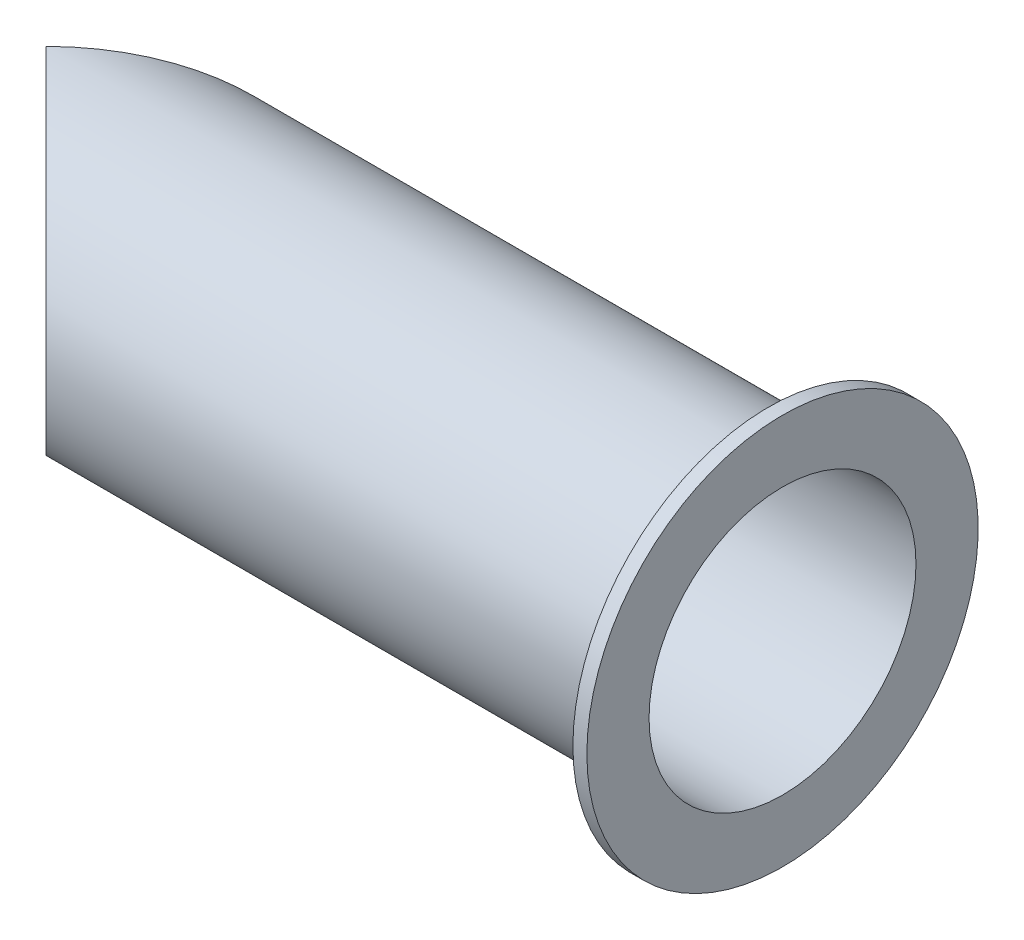
ISO-10303-21;
HEADER;
FILE_DESCRIPTION(('STEP AP214'),'2;1');
FILE_NAME('part.step','',(''),(''),'','','');
FILE_SCHEMA(('AUTOMOTIVE_DESIGN { 1 0 10303 214 1 1 1 1 }'));
ENDSEC;
DATA;
#1=APPLICATION_CONTEXT('core data for automotive mechanical design processes');
#2=APPLICATION_PROTOCOL_DEFINITION('international standard','automotive_design',2000,#1);
#3=PRODUCT_CONTEXT('',#1,'mechanical');
#4=PRODUCT('Part','Part','',(#3));
#5=PRODUCT_RELATED_PRODUCT_CATEGORY('part','',(#4));
#6=PRODUCT_DEFINITION_FORMATION('','',#4);
#7=PRODUCT_DEFINITION_CONTEXT('part definition',#1,'design');
#8=PRODUCT_DEFINITION('design','',#6,#7);
#9=PRODUCT_DEFINITION_SHAPE('','',#8);
#10=(LENGTH_UNIT() NAMED_UNIT(*) SI_UNIT(.MILLI.,.METRE.));
#11=(NAMED_UNIT(*) PLANE_ANGLE_UNIT() SI_UNIT($,.RADIAN.));
#12=(NAMED_UNIT(*) SI_UNIT($,.STERADIAN.) SOLID_ANGLE_UNIT());
#13=UNCERTAINTY_MEASURE_WITH_UNIT(LENGTH_MEASURE(1.E-05),#10,'distance_accuracy_value','');
#14=(GEOMETRIC_REPRESENTATION_CONTEXT(3) GLOBAL_UNCERTAINTY_ASSIGNED_CONTEXT((#13)) GLOBAL_UNIT_ASSIGNED_CONTEXT((#10,
#11,#12)) REPRESENTATION_CONTEXT('',''));
#15=CARTESIAN_POINT('',(0.,0.,0.));
#16=DIRECTION('',(0.,0.,1.));
#17=DIRECTION('',(1.,0.,0.));
#18=AXIS2_PLACEMENT_3D('',#15,#16,#17);
#19=CARTESIAN_POINT('',(0.,0.,0.));
#20=DIRECTION('',(-1.,0.,0.));
#21=DIRECTION('',(0.,0.,1.));
#22=AXIS2_PLACEMENT_3D('',#19,#20,#21);
#23=CYLINDRICAL_SURFACE('',#22,10.5);
#24=CARTESIAN_POINT('',(41.2,0.,0.));
#25=DIRECTION('',(-1.,0.,0.));
#26=DIRECTION('',(0.,0.,1.));
#27=AXIS2_PLACEMENT_3D('',#24,#25,#26);
#28=CIRCLE('',#27,10.5);
#29=CARTESIAN_POINT('',(41.2,0.,10.5));
#30=VERTEX_POINT('',#29);
#31=EDGE_CURVE('E59',#30,#30,#28,.T.);
#32=ORIENTED_EDGE('',*,*,#31,.T.);
#33=EDGE_LOOP('',(#32));
#34=FACE_BOUND('',#33,.T.);
#35=CARTESIAN_POINT('',(-10.5,0.,0.));
#36=DIRECTION('',(-0.707106781186547,0.,0.707106781186547));
#37=DIRECTION('',(-0.707106781186547,0.,-0.707106781186547));
#38=AXIS2_PLACEMENT_3D('',#35,#36,#37);
#39=ELLIPSE('',#38,14.8492424049175,10.5);
#40=CARTESIAN_POINT('',(-10.5,-10.5,0.));
#41=VERTEX_POINT('',#40);
#42=CARTESIAN_POINT('',(-10.5,10.5,0.));
#43=VERTEX_POINT('',#42);
#44=EDGE_CURVE('E52',#41,#43,#39,.T.);
#45=ORIENTED_EDGE('',*,*,#44,.F.);
#46=CARTESIAN_POINT('',(-10.5,0.,0.));
#47=DIRECTION('',(-0.707106781186547,0.,-0.707106781186547));
#48=DIRECTION('',(-0.707106781186547,0.,0.707106781186547));
#49=AXIS2_PLACEMENT_3D('',#46,#47,#48);
#50=ELLIPSE('',#49,14.8492424049175,10.5);
#51=EDGE_CURVE('E54',#43,#41,#50,.T.);
#52=ORIENTED_EDGE('',*,*,#51,.F.);
#53=EDGE_LOOP('',(#45,#52));
#54=FACE_BOUND('',#53,.T.);
#55=ADVANCED_FACE('F35',(#34,#54),#23,.T.);
#56=CARTESIAN_POINT('',(0.,0.,0.));
#57=DIRECTION('',(-1.,0.,0.));
#58=DIRECTION('',(0.,0.,1.));
#59=AXIS2_PLACEMENT_3D('',#56,#57,#58);
#60=CYLINDRICAL_SURFACE('',#59,9.55);
#61=CARTESIAN_POINT('',(42.2,0.,0.));
#62=DIRECTION('',(-1.,0.,0.));
#63=DIRECTION('',(0.,0.,1.));
#64=AXIS2_PLACEMENT_3D('',#61,#62,#63);
#65=CIRCLE('',#64,9.55);
#66=CARTESIAN_POINT('',(42.2,0.,9.55));
#67=VERTEX_POINT('',#66);
#68=EDGE_CURVE('E46',#67,#67,#65,.T.);
#69=ORIENTED_EDGE('',*,*,#68,.F.);
#70=EDGE_LOOP('',(#69));
#71=FACE_BOUND('',#70,.T.);
#72=CARTESIAN_POINT('',(0.,0.,9.55));
#73=CARTESIAN_POINT('',(-1.55016439686144E-06,0.220574282213808,9.54999842880472));
#74=CARTESIAN_POINT('',(-0.00696527093612184,0.441172881995941,9.54234347170654));
#75=CARTESIAN_POINT('',(-0.0346645493320943,0.880462247515584,9.51187602399584));
#76=CARTESIAN_POINT('',(-0.0554021637739905,1.09915272337616,9.48906126961228));
#77=CARTESIAN_POINT('',(-0.110201791348231,1.53294557827491,9.42870970253865));
#78=CARTESIAN_POINT('',(-0.14427303400446,1.74804536407523,9.39116269214881));
#79=CARTESIAN_POINT('',(-0.225014344574038,2.17288523109862,9.3020527420049));
#80=CARTESIAN_POINT('',(-0.271684243147141,2.38262538431976,9.25048999063825));
#81=CARTESIAN_POINT('',(-0.376354500288009,2.79402169189252,9.13462156791325));
#82=CARTESIAN_POINT('',(-0.434276671799415,2.99572267224584,9.07040378873359));
#83=CARTESIAN_POINT('',(-0.560662161095531,3.39157156837163,8.92994266069807));
#84=CARTESIAN_POINT('',(-0.629130112691609,3.58571611664613,8.8536940251277));
#85=CARTESIAN_POINT('',(-0.775515277782854,3.96558031099309,8.69019158388276));
#86=CARTESIAN_POINT('',(-0.853431642258823,4.1513007119882,8.60293876699807));
#87=CARTESIAN_POINT('',(-1.01765518739125,4.5138410023519,8.41838077874061));
#88=CARTESIAN_POINT('',(-1.10396426166289,4.690658869353,8.32107333846988));
#89=CARTESIAN_POINT('',(-1.31986214971061,5.10381809523147,8.07662760886038));
#90=CARTESIAN_POINT('',(-1.45297333421459,5.33574141040884,7.92510450748946));
#91=CARTESIAN_POINT('',(-1.73085282433067,5.78109040833513,7.60634907398851));
#92=CARTESIAN_POINT('',(-1.87562542236348,5.99450921923345,7.4391109535482));
#93=CARTESIAN_POINT('',(-2.17455742239463,6.40322035683602,7.09038668656487));
#94=CARTESIAN_POINT('',(-2.32873565544062,6.59847420245711,6.90887173127468));
#95=CARTESIAN_POINT('',(-2.64373683377131,6.97054793975606,6.53328725090287));
#96=CARTESIAN_POINT('',(-2.80455892597966,7.14737018785558,6.33921933583127));
#97=CARTESIAN_POINT('',(-3.13433265841546,7.48694031348743,5.93461444534024));
#98=CARTESIAN_POINT('',(-3.30338672880583,7.64925095561886,5.72379475912219));
#99=CARTESIAN_POINT('',(-3.64317701026206,7.95526535394853,5.29024495199638));
#100=CARTESIAN_POINT('',(-3.81391363140587,8.09896444700987,5.06751186585329));
#101=CARTESIAN_POINT('',(-4.15340186997913,8.36764221697699,4.61034249956056));
#102=CARTESIAN_POINT('',(-4.32215653170289,8.49265445083188,4.3759282307238));
#103=CARTESIAN_POINT('',(-4.65354709873289,8.72409021537935,3.89412032272076));
#104=CARTESIAN_POINT('',(-4.81618654298043,8.83052463132022,3.64673439525906));
#105=CARTESIAN_POINT('',(-5.12678136776727,9.02282379238248,3.14060418456797));
#106=CARTESIAN_POINT('',(-5.27491604729169,9.10896542905147,2.88207768132384));
#107=CARTESIAN_POINT('',(-5.5495244958063,9.26106423459288,2.34783724410935));
#108=CARTESIAN_POINT('',(-5.67600831919718,9.32703078379462,2.07213136961774));
#109=CARTESIAN_POINT('',(-5.87376299125925,9.42646281802629,1.54988898553449));
#110=CARTESIAN_POINT('',(-5.95075851300733,9.46354198625341,1.3063292929072));
#111=CARTESIAN_POINT('',(-6.03863095389858,9.5051156604462,0.933241147135417));
#112=CARTESIAN_POINT('',(-6.06330776869749,9.51662835144927,0.807711715494538));
#113=CARTESIAN_POINT('',(-6.10231346885637,9.53471679589305,0.554730248925886));
#114=CARTESIAN_POINT('',(-6.11664768833331,9.54129509427963,0.427279239714138));
#115=CARTESIAN_POINT('',(-6.13423022132566,9.54935347275128,0.170331434968808));
#116=CARTESIAN_POINT('',(-6.13738140884579,9.55078888728765,0.0408264818638232));
#117=CARTESIAN_POINT('',(-6.13213442875822,9.5483903189909,-0.217896091016035));
#118=CARTESIAN_POINT('',(-6.12373623181743,9.54455632277454,-0.347113710060302));
#119=CARTESIAN_POINT('',(-6.09587687143741,9.53173277981832,-0.604303203875862));
#120=CARTESIAN_POINT('',(-6.07639619089835,9.52273413749397,-0.73227247472453));
#121=CARTESIAN_POINT('',(-6.027427787887,9.49983278261041,-0.985850857175301));
#122=CARTESIAN_POINT('',(-5.99793593953962,9.48592804802359,-1.11145897311979));
#123=CARTESIAN_POINT('',(-5.91862014082505,9.44793606754178,-1.40263364741395));
#124=CARTESIAN_POINT('',(-5.86529191237304,9.42199042998925,-1.56700001627018));
#125=CARTESIAN_POINT('',(-5.74643425151322,9.36258607244638,-1.88983172148564));
#126=CARTESIAN_POINT('',(-5.68089874111454,9.32912360812019,-2.04829407086992));
#127=CARTESIAN_POINT('',(-5.54044586625239,9.25522192061193,-2.35989167110624));
#128=CARTESIAN_POINT('',(-5.46549988165019,9.2147612657087,-2.51300876823414));
#129=CARTESIAN_POINT('',(-5.30878294373484,9.12739532255464,-2.81383754919094));
#130=CARTESIAN_POINT('',(-5.22700936346913,9.08048754921492,-2.96154712071158));
#131=CARTESIAN_POINT('',(-4.97971373213672,8.93376801289111,-3.38805371462386));
#132=CARTESIAN_POINT('',(-4.80747165859402,8.82554744306821,-3.66008411362371));
#133=CARTESIAN_POINT('',(-4.45411542320309,8.5873690991685,-4.18850412978263));
#134=CARTESIAN_POINT('',(-4.27299416560689,8.45739373284015,-4.44488085757127));
#135=CARTESIAN_POINT('',(-3.90760562078547,8.17579532747067,-4.94378367640393));
#136=CARTESIAN_POINT('',(-3.72333415391744,8.02414118306894,-5.18628915219097));
#137=CARTESIAN_POINT('',(-3.35631516803992,7.69921205279239,-5.65742621861303));
#138=CARTESIAN_POINT('',(-3.1735672007705,7.52594368457637,-5.88606202403615));
#139=CARTESIAN_POINT('',(-2.80237844453799,7.14641215074716,-6.34227659181887));
#140=CARTESIAN_POINT('',(-2.61424293910516,6.93880150606195,-6.56898825916854));
#141=CARTESIAN_POINT('',(-2.24743480802765,6.49825750589455,-7.00508427261457));
#142=CARTESIAN_POINT('',(-2.06876488349823,6.26531697950263,-7.21446368223293));
#143=CARTESIAN_POINT('',(-1.72547517913569,5.7746924001176,-7.61281439753804));
#144=CARTESIAN_POINT('',(-1.56081014356669,5.51709424697263,-7.80185200581992));
#145=CARTESIAN_POINT('',(-1.24912709947325,4.97679050123585,-8.15710733119698));
#146=CARTESIAN_POINT('',(-1.10209586667824,4.69410400372635,-8.32334216259646));
#147=CARTESIAN_POINT('',(-0.88163422302096,4.21636767624743,-8.57130906887679));
#148=CARTESIAN_POINT('',(-0.801407965519166,4.02863909924136,-8.6612124109364));
#149=CARTESIAN_POINT('',(-0.650614447134722,3.64446798100714,-8.82974032908086));
#150=CARTESIAN_POINT('',(-0.580044221428796,3.4480281391575,-8.90836836753385));
#151=CARTESIAN_POINT('',(-0.449698740162347,3.04726506666906,-9.05328985743474));
#152=CARTESIAN_POINT('',(-0.38991868085887,2.84294539351745,-9.11958879815221));
#153=CARTESIAN_POINT('',(-0.282179367565618,2.42738687747593,-9.23888602283679));
#154=CARTESIAN_POINT('',(-0.234220517322117,2.21614779853695,-9.2918838525136));
#155=CARTESIAN_POINT('',(-0.150793550150092,1.78664586683344,-9.38397342422707));
#156=CARTESIAN_POINT('',(-0.115413410838005,1.56834476105856,-9.42296723831616));
#157=CARTESIAN_POINT('',(-0.0583800258488412,1.12778583339814,-9.48578416990148));
#158=CARTESIAN_POINT('',(-0.0367267258778368,0.905528027166156,-9.50960734740232));
#159=CARTESIAN_POINT('',(-0.00765383558497846,0.459028304646362,-9.54158647466287));
#160=CARTESIAN_POINT('',(-0.000229694721637733,0.234787045729678,-9.5497474332634));
#161=CARTESIAN_POINT('',(0.000219124936845714,-0.213717340796843,-9.55024094550488));
#162=CARTESIAN_POINT('',(-0.00675507279201301,-0.437980465335204,-9.54257473411093));
#163=CARTESIAN_POINT('',(-0.0335016574610959,-0.86189247565072,-9.51315507943714));
#164=CARTESIAN_POINT('',(-0.0519074469753848,-1.06173555258608,-9.4929057714004));
#165=CARTESIAN_POINT('',(-0.0998691105156604,-1.4584984233658,-9.44009242510562));
#166=CARTESIAN_POINT('',(-0.129428689094243,-1.65541722334843,-9.4075242953393));
#167=CARTESIAN_POINT('',(-0.199159472190343,-2.04495202889887,-9.33059907394564));
#168=CARTESIAN_POINT('',(-0.239327631883227,-2.23756925190819,-9.28624536493706));
#169=CARTESIAN_POINT('',(-0.329625249103798,-2.61756345827491,-9.18637454613411));
#170=CARTESIAN_POINT('',(-0.379758491656294,-2.80493841952664,-9.13085319445234));
#171=CARTESIAN_POINT('',(-0.491127015721263,-3.17994202893174,-9.00726278309859));
#172=CARTESIAN_POINT('',(-0.552688439581524,-3.36735173775612,-8.93882372601649));
#173=CARTESIAN_POINT('',(-0.68475294384914,-3.73485052400045,-8.7916224914048));
#174=CARTESIAN_POINT('',(-0.755259471112304,-3.91493674391526,-8.71285633409526));
#175=CARTESIAN_POINT('',(-0.978821115870656,-4.44333351095992,-8.46233264749426));
#176=CARTESIAN_POINT('',(-1.14397100553179,-4.77995525991497,-8.276291716785));
#177=CARTESIAN_POINT('',(-1.45577527514599,-5.34123078164447,-7.92185300040737));
#178=CARTESIAN_POINT('',(-1.59717267999165,-5.57321605625746,-7.76015281121345));
#179=CARTESIAN_POINT('',(-1.89131624315496,-6.01759840129866,-7.42085572572695));
#180=CARTESIAN_POINT('',(-2.0440635837837,-6.22999342585116,-7.24325717292261));
#181=CARTESIAN_POINT('',(-2.3585961690449,-6.63578666892647,-6.87345998931173));
#182=CARTESIAN_POINT('',(-2.52040625538978,-6.82912821786666,-6.68122065104451));
#183=CARTESIAN_POINT('',(-2.84999592920941,-7.19640821191732,-6.28389901134157));
#184=CARTESIAN_POINT('',(-3.01777447937636,-7.37035000714801,-6.07881893693773));
#185=CARTESIAN_POINT('',(-3.36067726999039,-7.70314852272935,-5.6514702391412));
#186=CARTESIAN_POINT('',(-3.53588122529484,-7.86154499439963,-5.42890784024927));
#187=CARTESIAN_POINT('',(-3.88655939829433,-8.15875092567028,-4.97109786462189));
#188=CARTESIAN_POINT('',(-4.06203369437093,-8.29755277696001,-4.73584540925324));
#189=CARTESIAN_POINT('',(-4.40867656370908,-8.5552481480142,-4.25265286559878));
#190=CARTESIAN_POINT('',(-4.57985454524045,-8.67418912250699,-4.00474492341309));
#191=CARTESIAN_POINT('',(-4.91252157230955,-8.89210225627363,-3.49428215853422));
#192=CARTESIAN_POINT('',(-5.07401932511121,-8.9910925562596,-3.23174092145891));
#193=CARTESIAN_POINT('',(-5.36266587688179,-9.15874818611278,-2.71755880998305));
#194=CARTESIAN_POINT('',(-5.49164054694359,-9.22950149679591,-2.4676459560891));
#195=CARTESIAN_POINT('',(-5.72457087064195,-9.3521421616201,-1.9519150448992));
#196=CARTESIAN_POINT('',(-5.82856259256946,-9.40405676949879,-1.68612061735177));
#197=CARTESIAN_POINT('',(-5.98314640959704,-9.47914990721538,-1.18383630669148));
#198=CARTESIAN_POINT('',(-6.03972320498754,-9.50565951744332,-0.949762575941793));
#199=CARTESIAN_POINT('',(-6.11614273105334,-9.54115890450965,-0.474565079416246));
#200=CARTESIAN_POINT('',(-6.13606869218358,-9.55018837947899,-0.233458553553935));
#201=CARTESIAN_POINT('',(-6.13522863849038,-9.5498050692226,0.249292214041436));
#202=CARTESIAN_POINT('',(-6.1143550750188,-9.54034354122291,0.490936195235516));
#203=CARTESIAN_POINT('',(-6.03602543076314,-9.50392683143218,0.967064897376575));
#204=CARTESIAN_POINT('',(-5.97848689061578,-9.47693221516291,1.2015322291637));
#205=CARTESIAN_POINT('',(-5.85168559259474,-9.41525105845096,1.60879647050014));
#206=CARTESIAN_POINT('',(-5.78778459086933,-9.38356199317581,1.78381538349107));
#207=CARTESIAN_POINT('',(-5.64744607354793,-9.31176329366399,2.12704288786811));
#208=CARTESIAN_POINT('',(-5.57099991177105,-9.27164784655007,2.29524668184409));
#209=CARTESIAN_POINT('',(-5.40876509143229,-9.18356525635248,2.62563838023031));
#210=CARTESIAN_POINT('',(-5.32294522738967,-9.13557160226819,2.78780362236339));
#211=CARTESIAN_POINT('',(-5.14478584287353,-9.03229319382483,3.10614995278231));
#212=CARTESIAN_POINT('',(-5.05244388733959,-8.97700570951484,3.2623287720705));
#213=CARTESIAN_POINT('',(-4.77949030855163,-8.80736566189615,3.7052748442559));
#214=CARTESIAN_POINT('',(-4.59316594435262,-8.68408505154265,3.98513183346054));
#215=CARTESIAN_POINT('',(-4.21380676182913,-8.41357811533717,4.52838178440256));
#216=CARTESIAN_POINT('',(-4.02076684249144,-8.26633326001688,4.79176178600195));
#217=CARTESIAN_POINT('',(-3.63402238874577,-7.94802301867264,5.30302154533462));
#218=CARTESIAN_POINT('',(-3.44031812473744,-7.77696640902357,5.55090696539946));
#219=CARTESIAN_POINT('',(-3.05676928313712,-7.41071038283583,6.03116857041811));
#220=CARTESIAN_POINT('',(-2.86692293302201,-7.21552235952821,6.2635519951875));
#221=CARTESIAN_POINT('',(-2.52844886741774,-6.83787899658739,6.6714761455923));
#222=CARTESIAN_POINT('',(-2.37855749233809,-6.65946577103518,6.8497147134133));
#223=CARTESIAN_POINT('',(-2.08601202851851,-6.28578582443041,7.19416157233789));
#224=CARTESIAN_POINT('',(-1.94335826422942,-6.09051834888612,7.36036932426098));
#225=CARTESIAN_POINT('',(-1.66768229174375,-5.68335482766449,7.67910907728425));
#226=CARTESIAN_POINT('',(-1.5346455253329,-5.47148497294588,7.83166183642432));
#227=CARTESIAN_POINT('',(-1.28026762720683,-5.03102026975657,8.1216257135314));
#228=CARTESIAN_POINT('',(-1.1589232179385,-4.80243014003524,8.25904107630672));
#229=CARTESIAN_POINT('',(-0.955791038379298,-4.38176245248664,8.48802423180545));
#230=CARTESIAN_POINT('',(-0.871209135834402,-4.19287709583013,8.58299028147399));
#231=CARTESIAN_POINT('',(-0.71177245970175,-3.80583506867972,8.76147868470747));
#232=CARTESIAN_POINT('',(-0.636915543339968,-3.6076804536776,8.8450035594076));
#233=CARTESIAN_POINT('',(-0.498181844881826,-3.20302026408344,8.99944531909741));
#234=CARTESIAN_POINT('',(-0.434294435193521,-2.9965230145009,9.07037440957541));
#235=CARTESIAN_POINT('',(-0.318573329693684,-2.57605594538368,9.19862566557317));
#236=CARTESIAN_POINT('',(-0.266737559963487,-2.36208741885133,9.25595017228682));
#237=CARTESIAN_POINT('',(-0.185266226058173,-1.97171328125714,9.34593595730118));
#238=CARTESIAN_POINT('',(-0.153262567295041,-1.79640456917985,9.38123866055458));
#239=CARTESIAN_POINT('',(-0.0980525974233897,-1.44274309790956,9.44209585790084));
#240=CARTESIAN_POINT('',(-0.0748451944536637,-1.26439071939464,9.46765156187122));
#241=CARTESIAN_POINT('',(-0.0375655777588238,-0.905543899869689,9.50868590742168));
#242=CARTESIAN_POINT('',(-0.0234950779382622,-0.725049063438531,9.52416265838863));
#243=CARTESIAN_POINT('',(-0.00471293754264724,-0.36304144571577,9.54481893587073));
#244=CARTESIAN_POINT('',(1.2757594498768E-06,-0.18152895802145,9.55000129306753));
#245=CARTESIAN_POINT('',(0.,0.,9.55));
#246=B_SPLINE_CURVE_WITH_KNOTS('',3,(#72,#73,#74,#75,#76,#77,#78,#79,#80,#81,#82,#83,#84,#85,
#86,#87,#88,#89,#90,#91,#92,#93,#94,#95,#96,#97,#98,#99,#100,#101,#102,#103,#104,#105,#106,#107,
#108,#109,#110,#111,#112,#113,#114,#115,#116,#117,#118,#119,#120,#121,#122,#123,#124,#125,#126,
#127,#128,#129,#130,#131,#132,#133,#134,#135,#136,#137,#138,#139,#140,#141,#142,#143,#144,#145,
#146,#147,#148,#149,#150,#151,#152,#153,#154,#155,#156,#157,#158,#159,#160,#161,#162,#163,#164,
#165,#166,#167,#168,#169,#170,#171,#172,#173,#174,#175,#176,#177,#178,#179,#180,#181,#182,#183,
#184,#185,#186,#187,#188,#189,#190,#191,#192,#193,#194,#195,#196,#197,#198,#199,#200,#201,#202,
#203,#204,#205,#206,#207,#208,#209,#210,#211,#212,#213,#214,#215,#216,#217,#218,#219,#220,#221,
#222,#223,#224,#225,#226,#227,#228,#229,#230,#231,#232,#233,#234,#235,#236,#237,#238,#239,#240,
#241,#242,#243,#244,#245),.UNSPECIFIED.,.T.,.F.,(4,2,2,2,2,2,2,2,2,2,2,2,2,2,2,2,2,2,2,2,2,2,2,
2,2,2,2,2,2,2,2,2,2,2,2,2,2,2,2,2,2,2,2,2,2,2,2,2,2,2,2,2,2,2,2,2,2,2,2,2,2,2,2,2,2,2,2,2,2,2,2,
2,2,2,2,2,2,2,2,2,2,2,2,2,2,2,4),(0.,0.661524985005622,1.32314877593289,1.98523135453965,
2.64730503444751,3.30493296630472,3.96285068831393,4.62070933464153,5.27871675704393,
6.19941696622254,7.12045763604393,8.04340702972203,8.96623828213189,9.91111927364743,
10.856236549674,11.7996356972298,12.742480212383,13.6715990401252,14.6002852186023,
15.3715601642722,15.7564563451032,16.1411538764113,16.5291844851474,16.9172160794046,
17.3059331517399,17.6948106198648,18.2181444799897,18.7417396073026,19.266967575499,
19.7923985674158,20.8098377936896,21.8281037938835,22.8478457775277,23.8672763080577,
24.9471741500608,26.0273785118817,27.1039479760433,28.1797049626437,28.8483438883423,
29.5167770497839,30.1849118892431,30.8530695452842,31.5258125038447,32.1985528014805,
32.8710779181799,33.5435505609592,34.1479692160039,34.7525887959895,35.3570350291655,
35.9617112886162,36.5874703916534,37.2134713577419,38.4649082977989,39.412257242812,
40.3597050109078,41.309890662669,42.25991197311,43.23265333002,44.2057713556861,
45.1765299108154,46.1464017540108,47.0149199501661,47.8821766139602,48.6061112568693,
49.3283998757335,50.0525950347917,50.7784246815371,51.3446195662641,51.9112063266779,
52.4797403413913,53.0484877552008,54.1211915528826,55.1947287545062,56.267871321583,
57.3405091440393,58.2198876015846,59.0993054455295,59.9773628686064,60.8551734378255,
61.5376764281848,62.2200287819267,62.9017162753158,63.5832863728505,64.1278256859141,
64.6722973842753,65.2168711854115,65.7612952226473),.UNSPECIFIED.);
#247=CARTESIAN_POINT('',(0.,0.,9.55));
#248=VERTEX_POINT('',#247);
#249=EDGE_CURVE('E11',#248,#248,#246,.T.);
#250=ORIENTED_EDGE('',*,*,#249,.T.);
#251=EDGE_LOOP('',(#250));
#252=FACE_BOUND('',#251,.T.);
#253=ADVANCED_FACE('F74',(#71,#252),#60,.F.);
#254=CARTESIAN_POINT('',(42.2,0.,0.));
#255=DIRECTION('',(-1.,0.,0.));
#256=DIRECTION('',(0.,0.,1.));
#257=AXIS2_PLACEMENT_3D('',#254,#255,#256);
#258=PLANE('',#257);
#259=CARTESIAN_POINT('',(42.2,0.,0.));
#260=DIRECTION('',(-1.,0.,0.));
#261=DIRECTION('',(0.,0.,1.));
#262=AXIS2_PLACEMENT_3D('',#259,#260,#261);
#263=CIRCLE('',#262,14.);
#264=CARTESIAN_POINT('',(42.2,0.,14.));
#265=VERTEX_POINT('',#264);
#266=EDGE_CURVE('E67',#265,#265,#263,.T.);
#267=ORIENTED_EDGE('',*,*,#266,.F.);
#268=EDGE_LOOP('',(#267));
#269=FACE_BOUND('',#268,.T.);
#270=ORIENTED_EDGE('',*,*,#68,.T.);
#271=EDGE_LOOP('',(#270));
#272=FACE_BOUND('',#271,.T.);
#273=ADVANCED_FACE('F72',(#269,#272),#258,.F.);
#274=CARTESIAN_POINT('',(0.,0.,0.));
#275=DIRECTION('',(-1.,0.,0.));
#276=DIRECTION('',(0.,0.,1.));
#277=AXIS2_PLACEMENT_3D('',#274,#275,#276);
#278=CYLINDRICAL_SURFACE('',#277,14.);
#279=CARTESIAN_POINT('',(41.2,0.,0.));
#280=DIRECTION('',(-1.,0.,0.));
#281=DIRECTION('',(0.,0.,1.));
#282=AXIS2_PLACEMENT_3D('',#279,#280,#281);
#283=CIRCLE('',#282,14.);
#284=CARTESIAN_POINT('',(41.2,0.,14.));
#285=VERTEX_POINT('',#284);
#286=EDGE_CURVE('E62',#285,#285,#283,.T.);
#287=ORIENTED_EDGE('',*,*,#286,.F.);
#288=EDGE_LOOP('',(#287));
#289=FACE_BOUND('',#288,.T.);
#290=ORIENTED_EDGE('',*,*,#266,.T.);
#291=EDGE_LOOP('',(#290));
#292=FACE_BOUND('',#291,.T.);
#293=ADVANCED_FACE('F83',(#289,#292),#278,.T.);
#294=CARTESIAN_POINT('',(41.2,0.,0.));
#295=DIRECTION('',(1.,0.,0.));
#296=DIRECTION('',(0.,0.,-1.));
#297=AXIS2_PLACEMENT_3D('',#294,#295,#296);
#298=PLANE('',#297);
#299=ORIENTED_EDGE('',*,*,#31,.F.);
#300=EDGE_LOOP('',(#299));
#301=FACE_BOUND('',#300,.T.);
#302=ORIENTED_EDGE('',*,*,#286,.T.);
#303=EDGE_LOOP('',(#302));
#304=FACE_BOUND('',#303,.T.);
#305=ADVANCED_FACE('F79',(#301,#304),#298,.F.);
#306=CARTESIAN_POINT('',(-10.5,0.,-14.));
#307=DIRECTION('',(0.,0.,1.));
#308=DIRECTION('',(1.,0.,0.));
#309=AXIS2_PLACEMENT_3D('',#306,#307,#308);
#310=CYLINDRICAL_SURFACE('',#309,10.5);
#311=ORIENTED_EDGE('',*,*,#44,.T.);
#312=ORIENTED_EDGE('',*,*,#51,.T.);
#313=EDGE_LOOP('',(#311,#312));
#314=FACE_BOUND('',#313,.T.);
#315=ORIENTED_EDGE('',*,*,#249,.F.);
#316=EDGE_LOOP('',(#315));
#317=FACE_BOUND('',#316,.T.);
#318=ADVANCED_FACE('F55',(#314,#317),#310,.F.);
#319=CLOSED_SHELL('',(#55,#253,#273,#293,#305,#318));
#320=MANIFOLD_SOLID_BREP('B2',#319);
#321=ADVANCED_BREP_SHAPE_REPRESENTATION('',(#18,#320),#14);
#322=SHAPE_DEFINITION_REPRESENTATION(#9,#321);
ENDSEC;
END-ISO-10303-21;
